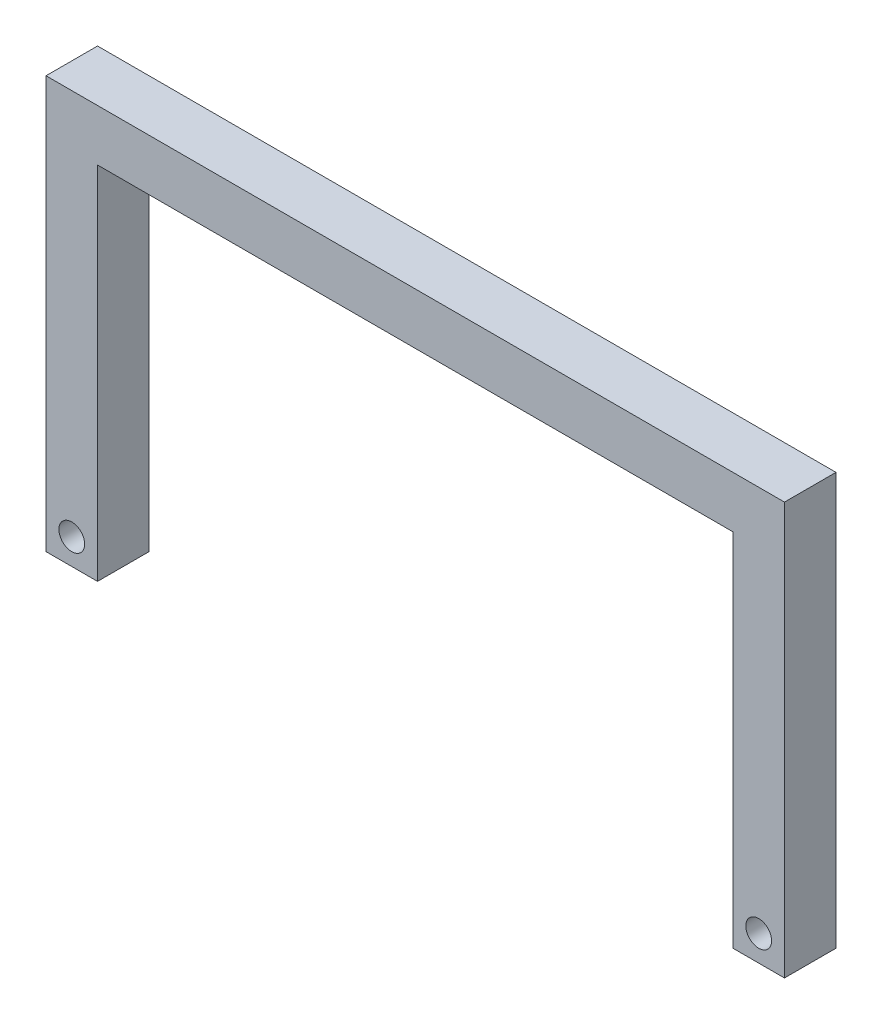
ISO-10303-21;
HEADER;
FILE_DESCRIPTION(('STEP AP214'),'2;1');
FILE_NAME('part.step','',(''),(''),'','','');
FILE_SCHEMA(('AUTOMOTIVE_DESIGN { 1 0 10303 214 1 1 1 1 }'));
ENDSEC;
DATA;
#1=APPLICATION_CONTEXT('core data for automotive mechanical design processes');
#2=APPLICATION_PROTOCOL_DEFINITION('international standard','automotive_design',2000,#1);
#3=PRODUCT_CONTEXT('',#1,'mechanical');
#4=PRODUCT('Part','Part','',(#3));
#5=PRODUCT_RELATED_PRODUCT_CATEGORY('part','',(#4));
#6=PRODUCT_DEFINITION_FORMATION('','',#4);
#7=PRODUCT_DEFINITION_CONTEXT('part definition',#1,'design');
#8=PRODUCT_DEFINITION('design','',#6,#7);
#9=PRODUCT_DEFINITION_SHAPE('','',#8);
#10=(LENGTH_UNIT() NAMED_UNIT(*) SI_UNIT(.MILLI.,.METRE.));
#11=(NAMED_UNIT(*) PLANE_ANGLE_UNIT() SI_UNIT($,.RADIAN.));
#12=(NAMED_UNIT(*) SI_UNIT($,.STERADIAN.) SOLID_ANGLE_UNIT());
#13=UNCERTAINTY_MEASURE_WITH_UNIT(LENGTH_MEASURE(1.E-05),#10,'distance_accuracy_value','');
#14=(GEOMETRIC_REPRESENTATION_CONTEXT(3) GLOBAL_UNCERTAINTY_ASSIGNED_CONTEXT((#13)) GLOBAL_UNIT_ASSIGNED_CONTEXT((#10,
#11,#12)) REPRESENTATION_CONTEXT('',''));
#15=CARTESIAN_POINT('',(0.,0.,0.));
#16=DIRECTION('',(0.,0.,1.));
#17=DIRECTION('',(1.,0.,0.));
#18=AXIS2_PLACEMENT_3D('',#15,#16,#17);
#19=CARTESIAN_POINT('',(0.,-15.,15.));
#20=DIRECTION('',(0.,-1.,0.));
#21=DIRECTION('',(0.,0.,-1.));
#22=AXIS2_PLACEMENT_3D('',#19,#20,#21);
#23=PLANE('',#22);
#24=DIRECTION('',(-1.,0.,0.));
#25=VECTOR('',#24,1.);
#26=CARTESIAN_POINT('',(0.,-15.,-15.));
#27=LINE('',#26,#25);
#28=CARTESIAN_POINT('',(185.,-15.,-15.));
#29=VERTEX_POINT('',#28);
#30=CARTESIAN_POINT('',(-185.,-15.,-15.));
#31=VERTEX_POINT('',#30);
#32=EDGE_CURVE('E188',#29,#31,#27,.T.);
#33=ORIENTED_EDGE('',*,*,#32,.F.);
#34=DIRECTION('',(0.,0.,-1.));
#35=VECTOR('',#34,1.);
#36=CARTESIAN_POINT('',(185.,-15.,15.));
#37=LINE('',#36,#35);
#38=CARTESIAN_POINT('',(185.,-15.,15.));
#39=VERTEX_POINT('',#38);
#40=EDGE_CURVE('E11',#39,#29,#37,.T.);
#41=ORIENTED_EDGE('',*,*,#40,.F.);
#42=DIRECTION('',(-1.,0.,0.));
#43=VECTOR('',#42,1.);
#44=CARTESIAN_POINT('',(0.,-15.,15.));
#45=LINE('',#44,#43);
#46=CARTESIAN_POINT('',(-185.,-15.,15.));
#47=VERTEX_POINT('',#46);
#48=EDGE_CURVE('E377',#39,#47,#45,.T.);
#49=ORIENTED_EDGE('',*,*,#48,.T.);
#50=DIRECTION('',(0.,0.,-1.));
#51=VECTOR('',#50,1.);
#52=CARTESIAN_POINT('',(-185.,-15.,15.));
#53=LINE('',#52,#51);
#54=EDGE_CURVE('E70',#47,#31,#53,.T.);
#55=ORIENTED_EDGE('',*,*,#54,.T.);
#56=EDGE_LOOP('',(#33,#41,#49,#55));
#57=FACE_BOUND('',#56,.T.);
#58=ADVANCED_FACE('F49',(#57),#23,.T.);
#59=CARTESIAN_POINT('',(185.,0.,15.));
#60=DIRECTION('',(1.,0.,0.));
#61=DIRECTION('',(0.,1.,0.));
#62=AXIS2_PLACEMENT_3D('',#59,#60,#61);
#63=PLANE('',#62);
#64=DIRECTION('',(0.,-1.,0.));
#65=VECTOR('',#64,1.);
#66=CARTESIAN_POINT('',(185.,0.,-15.));
#67=LINE('',#66,#65);
#68=CARTESIAN_POINT('',(185.,-225.,-15.));
#69=VERTEX_POINT('',#68);
#70=EDGE_CURVE('E184',#29,#69,#67,.T.);
#71=ORIENTED_EDGE('',*,*,#70,.T.);
#72=DIRECTION('',(0.,0.,-1.));
#73=VECTOR('',#72,1.);
#74=CARTESIAN_POINT('',(185.,-225.,15.));
#75=LINE('',#74,#73);
#76=CARTESIAN_POINT('',(185.,-225.,15.));
#77=VERTEX_POINT('',#76);
#78=EDGE_CURVE('E59',#77,#69,#75,.T.);
#79=ORIENTED_EDGE('',*,*,#78,.F.);
#80=DIRECTION('',(0.,-1.,0.));
#81=VECTOR('',#80,1.);
#82=CARTESIAN_POINT('',(185.,0.,15.));
#83=LINE('',#82,#81);
#84=EDGE_CURVE('E371',#39,#77,#83,.T.);
#85=ORIENTED_EDGE('',*,*,#84,.F.);
#86=ORIENTED_EDGE('',*,*,#40,.T.);
#87=EDGE_LOOP('',(#71,#79,#85,#86));
#88=FACE_BOUND('',#87,.T.);
#89=ADVANCED_FACE('F185',(#88),#63,.F.);
#90=CARTESIAN_POINT('',(2.08166817117217E-13,-225.,15.));
#91=DIRECTION('',(0.,-1.,0.));
#92=DIRECTION('',(1.,0.,0.));
#93=AXIS2_PLACEMENT_3D('',#90,#91,#92);
#94=PLANE('',#93);
#95=DIRECTION('',(-1.,0.,0.));
#96=VECTOR('',#95,1.);
#97=CARTESIAN_POINT('',(2.08166817117217E-13,-225.,-15.));
#98=LINE('',#97,#96);
#99=CARTESIAN_POINT('',(215.,-225.,-15.));
#100=VERTEX_POINT('',#99);
#101=EDGE_CURVE('E178',#100,#69,#98,.T.);
#102=ORIENTED_EDGE('',*,*,#101,.F.);
#103=DIRECTION('',(0.,0.,-1.));
#104=VECTOR('',#103,1.);
#105=CARTESIAN_POINT('',(215.,-225.,15.));
#106=LINE('',#105,#104);
#107=CARTESIAN_POINT('',(215.,-225.,15.));
#108=VERTEX_POINT('',#107);
#109=EDGE_CURVE('E168',#108,#100,#106,.T.);
#110=ORIENTED_EDGE('',*,*,#109,.F.);
#111=DIRECTION('',(-1.,0.,0.));
#112=VECTOR('',#111,1.);
#113=CARTESIAN_POINT('',(2.08166817117217E-13,-225.,15.));
#114=LINE('',#113,#112);
#115=EDGE_CURVE('E181',#108,#77,#114,.T.);
#116=ORIENTED_EDGE('',*,*,#115,.T.);
#117=ORIENTED_EDGE('',*,*,#78,.T.);
#118=EDGE_LOOP('',(#102,#110,#116,#117));
#119=FACE_BOUND('',#118,.T.);
#120=ADVANCED_FACE('F176',(#119),#94,.T.);
#121=CARTESIAN_POINT('',(215.,0.,15.));
#122=DIRECTION('',(1.,0.,0.));
#123=DIRECTION('',(0.,1.,0.));
#124=AXIS2_PLACEMENT_3D('',#121,#122,#123);
#125=PLANE('',#124);
#126=DIRECTION('',(0.,-1.,0.));
#127=VECTOR('',#126,1.);
#128=CARTESIAN_POINT('',(215.,0.,-15.));
#129=LINE('',#128,#127);
#130=CARTESIAN_POINT('',(215.,15.,-15.));
#131=VERTEX_POINT('',#130);
#132=EDGE_CURVE('E193',#131,#100,#129,.T.);
#133=ORIENTED_EDGE('',*,*,#132,.F.);
#134=DIRECTION('',(0.,0.,-1.));
#135=VECTOR('',#134,1.);
#136=CARTESIAN_POINT('',(215.,15.,15.));
#137=LINE('',#136,#135);
#138=CARTESIAN_POINT('',(215.,15.,15.));
#139=VERTEX_POINT('',#138);
#140=EDGE_CURVE('E161',#139,#131,#137,.T.);
#141=ORIENTED_EDGE('',*,*,#140,.F.);
#142=DIRECTION('',(0.,-1.,0.));
#143=VECTOR('',#142,1.);
#144=CARTESIAN_POINT('',(215.,0.,15.));
#145=LINE('',#144,#143);
#146=EDGE_CURVE('E370',#139,#108,#145,.T.);
#147=ORIENTED_EDGE('',*,*,#146,.T.);
#148=ORIENTED_EDGE('',*,*,#109,.T.);
#149=EDGE_LOOP('',(#133,#141,#147,#148));
#150=FACE_BOUND('',#149,.T.);
#151=ADVANCED_FACE('F309',(#150),#125,.T.);
#152=CARTESIAN_POINT('',(0.,15.,15.));
#153=DIRECTION('',(0.,-1.,0.));
#154=DIRECTION('',(0.,0.,-1.));
#155=AXIS2_PLACEMENT_3D('',#152,#153,#154);
#156=PLANE('',#155);
#157=DIRECTION('',(-1.,0.,0.));
#158=VECTOR('',#157,1.);
#159=CARTESIAN_POINT('',(0.,15.,-15.));
#160=LINE('',#159,#158);
#161=CARTESIAN_POINT('',(-215.,15.,-15.));
#162=VERTEX_POINT('',#161);
#163=EDGE_CURVE('E197',#131,#162,#160,.T.);
#164=ORIENTED_EDGE('',*,*,#163,.T.);
#165=DIRECTION('',(0.,0.,-1.));
#166=VECTOR('',#165,1.);
#167=CARTESIAN_POINT('',(-215.,15.,15.));
#168=LINE('',#167,#166);
#169=CARTESIAN_POINT('',(-215.,15.,15.));
#170=VERTEX_POINT('',#169);
#171=EDGE_CURVE('E157',#170,#162,#168,.T.);
#172=ORIENTED_EDGE('',*,*,#171,.F.);
#173=DIRECTION('',(-1.,0.,0.));
#174=VECTOR('',#173,1.);
#175=CARTESIAN_POINT('',(0.,15.,15.));
#176=LINE('',#175,#174);
#177=EDGE_CURVE('E148',#139,#170,#176,.T.);
#178=ORIENTED_EDGE('',*,*,#177,.F.);
#179=ORIENTED_EDGE('',*,*,#140,.T.);
#180=EDGE_LOOP('',(#164,#172,#178,#179));
#181=FACE_BOUND('',#180,.T.);
#182=ADVANCED_FACE('F299',(#181),#156,.F.);
#183=CARTESIAN_POINT('',(-215.,1.98914958578674E-13,15.));
#184=DIRECTION('',(1.,0.,0.));
#185=DIRECTION('',(0.,1.,0.));
#186=AXIS2_PLACEMENT_3D('',#183,#184,#185);
#187=PLANE('',#186);
#188=DIRECTION('',(0.,-1.,0.));
#189=VECTOR('',#188,1.);
#190=CARTESIAN_POINT('',(-215.,1.98914958578674E-13,-15.));
#191=LINE('',#190,#189);
#192=CARTESIAN_POINT('',(-215.,-225.,-15.));
#193=VERTEX_POINT('',#192);
#194=EDGE_CURVE('E155',#162,#193,#191,.T.);
#195=ORIENTED_EDGE('',*,*,#194,.T.);
#196=DIRECTION('',(0.,0.,-1.));
#197=VECTOR('',#196,1.);
#198=CARTESIAN_POINT('',(-215.,-225.,15.));
#199=LINE('',#198,#197);
#200=CARTESIAN_POINT('',(-215.,-225.,15.));
#201=VERTEX_POINT('',#200);
#202=EDGE_CURVE('E135',#201,#193,#199,.T.);
#203=ORIENTED_EDGE('',*,*,#202,.F.);
#204=DIRECTION('',(0.,-1.,0.));
#205=VECTOR('',#204,1.);
#206=CARTESIAN_POINT('',(-215.,1.98914958578674E-13,15.));
#207=LINE('',#206,#205);
#208=EDGE_CURVE('E141',#170,#201,#207,.T.);
#209=ORIENTED_EDGE('',*,*,#208,.F.);
#210=ORIENTED_EDGE('',*,*,#171,.T.);
#211=EDGE_LOOP('',(#195,#203,#209,#210));
#212=FACE_BOUND('',#211,.T.);
#213=ADVANCED_FACE('F154',(#212),#187,.F.);
#214=CARTESIAN_POINT('',(0.,-225.,15.));
#215=DIRECTION('',(0.,1.,0.));
#216=DIRECTION('',(0.,0.,1.));
#217=AXIS2_PLACEMENT_3D('',#214,#215,#216);
#218=PLANE('',#217);
#219=DIRECTION('',(1.,0.,0.));
#220=VECTOR('',#219,1.);
#221=CARTESIAN_POINT('',(0.,-225.,-15.));
#222=LINE('',#221,#220);
#223=CARTESIAN_POINT('',(-185.,-225.,-15.));
#224=VERTEX_POINT('',#223);
#225=EDGE_CURVE('E206',#193,#224,#222,.T.);
#226=ORIENTED_EDGE('',*,*,#225,.T.);
#227=DIRECTION('',(0.,0.,-1.));
#228=VECTOR('',#227,1.);
#229=CARTESIAN_POINT('',(-185.,-225.,15.));
#230=LINE('',#229,#228);
#231=CARTESIAN_POINT('',(-185.,-225.,15.));
#232=VERTEX_POINT('',#231);
#233=EDGE_CURVE('E102',#232,#224,#230,.T.);
#234=ORIENTED_EDGE('',*,*,#233,.F.);
#235=DIRECTION('',(1.,0.,0.));
#236=VECTOR('',#235,1.);
#237=CARTESIAN_POINT('',(0.,-225.,15.));
#238=LINE('',#237,#236);
#239=EDGE_CURVE('E131',#201,#232,#238,.T.);
#240=ORIENTED_EDGE('',*,*,#239,.F.);
#241=ORIENTED_EDGE('',*,*,#202,.T.);
#242=EDGE_LOOP('',(#226,#234,#240,#241));
#243=FACE_BOUND('',#242,.T.);
#244=ADVANCED_FACE('F133',(#243),#218,.F.);
#245=CARTESIAN_POINT('',(-200.,-210.,15.));
#246=DIRECTION('',(0.,0.,-1.));
#247=DIRECTION('',(-1.,0.,0.));
#248=AXIS2_PLACEMENT_3D('',#245,#246,#247);
#249=CYLINDRICAL_SURFACE('',#248,7.49999999999999);
#250=CARTESIAN_POINT('',(-200.,-210.,15.));
#251=DIRECTION('',(0.,0.,1.));
#252=DIRECTION('',(1.,0.,0.));
#253=AXIS2_PLACEMENT_3D('',#250,#251,#252);
#254=CIRCLE('',#253,7.49999999999999);
#255=CARTESIAN_POINT('',(-192.5,-210.,15.));
#256=VERTEX_POINT('',#255);
#257=EDGE_CURVE('E253',#256,#256,#254,.T.);
#258=ORIENTED_EDGE('',*,*,#257,.T.);
#259=EDGE_LOOP('',(#258));
#260=FACE_BOUND('',#259,.T.);
#261=CARTESIAN_POINT('',(-200.,-210.,-15.));
#262=DIRECTION('',(0.,0.,1.));
#263=DIRECTION('',(1.,0.,0.));
#264=AXIS2_PLACEMENT_3D('',#261,#262,#263);
#265=CIRCLE('',#264,7.49999999999999);
#266=CARTESIAN_POINT('',(-192.5,-210.,-15.));
#267=VERTEX_POINT('',#266);
#268=EDGE_CURVE('E221',#267,#267,#265,.T.);
#269=ORIENTED_EDGE('',*,*,#268,.F.);
#270=EDGE_LOOP('',(#269));
#271=FACE_BOUND('',#270,.T.);
#272=ADVANCED_FACE('F234',(#260,#271),#249,.F.);
#273=CARTESIAN_POINT('',(200.,-210.,15.));
#274=DIRECTION('',(0.,0.,-1.));
#275=DIRECTION('',(-1.,0.,0.));
#276=AXIS2_PLACEMENT_3D('',#273,#274,#275);
#277=CYLINDRICAL_SURFACE('',#276,7.49999999999999);
#278=CARTESIAN_POINT('',(200.,-210.,15.));
#279=DIRECTION('',(0.,0.,1.));
#280=DIRECTION('',(1.,0.,0.));
#281=AXIS2_PLACEMENT_3D('',#278,#279,#280);
#282=CIRCLE('',#281,7.49999999999999);
#283=CARTESIAN_POINT('',(207.5,-210.,15.));
#284=VERTEX_POINT('',#283);
#285=EDGE_CURVE('E212',#284,#284,#282,.T.);
#286=ORIENTED_EDGE('',*,*,#285,.T.);
#287=EDGE_LOOP('',(#286));
#288=FACE_BOUND('',#287,.T.);
#289=CARTESIAN_POINT('',(200.,-210.,-15.));
#290=DIRECTION('',(0.,0.,1.));
#291=DIRECTION('',(1.,0.,0.));
#292=AXIS2_PLACEMENT_3D('',#289,#290,#291);
#293=CIRCLE('',#292,7.49999999999999);
#294=CARTESIAN_POINT('',(207.5,-210.,-15.));
#295=VERTEX_POINT('',#294);
#296=EDGE_CURVE('E217',#295,#295,#293,.T.);
#297=ORIENTED_EDGE('',*,*,#296,.F.);
#298=EDGE_LOOP('',(#297));
#299=FACE_BOUND('',#298,.T.);
#300=ADVANCED_FACE('F51',(#288,#299),#277,.F.);
#301=CARTESIAN_POINT('',(-185.,0.,15.));
#302=DIRECTION('',(1.,0.,0.));
#303=DIRECTION('',(0.,1.,0.));
#304=AXIS2_PLACEMENT_3D('',#301,#302,#303);
#305=PLANE('',#304);
#306=DIRECTION('',(0.,-1.,0.));
#307=VECTOR('',#306,1.);
#308=CARTESIAN_POINT('',(-185.,0.,-15.));
#309=LINE('',#308,#307);
#310=EDGE_CURVE('E209',#31,#224,#309,.T.);
#311=ORIENTED_EDGE('',*,*,#310,.F.);
#312=ORIENTED_EDGE('',*,*,#54,.F.);
#313=DIRECTION('',(0.,-1.,0.));
#314=VECTOR('',#313,1.);
#315=CARTESIAN_POINT('',(-185.,0.,15.));
#316=LINE('',#315,#314);
#317=EDGE_CURVE('E140',#47,#232,#316,.T.);
#318=ORIENTED_EDGE('',*,*,#317,.T.);
#319=ORIENTED_EDGE('',*,*,#233,.T.);
#320=EDGE_LOOP('',(#311,#312,#318,#319));
#321=FACE_BOUND('',#320,.T.);
#322=ADVANCED_FACE('F225',(#321),#305,.T.);
#323=CARTESIAN_POINT('',(0.,0.,15.));
#324=DIRECTION('',(0.,0.,1.));
#325=DIRECTION('',(1.,0.,0.));
#326=AXIS2_PLACEMENT_3D('',#323,#324,#325);
#327=PLANE('',#326);
#328=ORIENTED_EDGE('',*,*,#285,.F.);
#329=EDGE_LOOP('',(#328));
#330=FACE_BOUND('',#329,.T.);
#331=ORIENTED_EDGE('',*,*,#257,.F.);
#332=EDGE_LOOP('',(#331));
#333=FACE_BOUND('',#332,.T.);
#334=ORIENTED_EDGE('',*,*,#48,.F.);
#335=ORIENTED_EDGE('',*,*,#84,.T.);
#336=ORIENTED_EDGE('',*,*,#115,.F.);
#337=ORIENTED_EDGE('',*,*,#146,.F.);
#338=ORIENTED_EDGE('',*,*,#177,.T.);
#339=ORIENTED_EDGE('',*,*,#208,.T.);
#340=ORIENTED_EDGE('',*,*,#239,.T.);
#341=ORIENTED_EDGE('',*,*,#317,.F.);
#342=EDGE_LOOP('',(#334,#335,#336,#337,#338,#339,#340,#341));
#343=FACE_BOUND('',#342,.T.);
#344=ADVANCED_FACE('F145',(#330,#333,#343),#327,.T.);
#345=CARTESIAN_POINT('',(0.,0.,-15.));
#346=DIRECTION('',(0.,0.,1.));
#347=DIRECTION('',(1.,0.,0.));
#348=AXIS2_PLACEMENT_3D('',#345,#346,#347);
#349=PLANE('',#348);
#350=ORIENTED_EDGE('',*,*,#296,.T.);
#351=EDGE_LOOP('',(#350));
#352=FACE_BOUND('',#351,.T.);
#353=ORIENTED_EDGE('',*,*,#268,.T.);
#354=EDGE_LOOP('',(#353));
#355=FACE_BOUND('',#354,.T.);
#356=ORIENTED_EDGE('',*,*,#32,.T.);
#357=ORIENTED_EDGE('',*,*,#310,.T.);
#358=ORIENTED_EDGE('',*,*,#225,.F.);
#359=ORIENTED_EDGE('',*,*,#194,.F.);
#360=ORIENTED_EDGE('',*,*,#163,.F.);
#361=ORIENTED_EDGE('',*,*,#132,.T.);
#362=ORIENTED_EDGE('',*,*,#101,.T.);
#363=ORIENTED_EDGE('',*,*,#70,.F.);
#364=EDGE_LOOP('',(#356,#357,#358,#359,#360,#361,#362,#363));
#365=FACE_BOUND('',#364,.T.);
#366=ADVANCED_FACE('F190',(#352,#355,#365),#349,.F.);
#367=CLOSED_SHELL('',(#58,#89,#120,#151,#182,#213,#244,#272,#300,#322,#344,#366));
#368=MANIFOLD_SOLID_BREP('B2',#367);
#369=ADVANCED_BREP_SHAPE_REPRESENTATION('',(#18,#368),#14);
#370=SHAPE_DEFINITION_REPRESENTATION(#9,#369);
ENDSEC;
END-ISO-10303-21;
